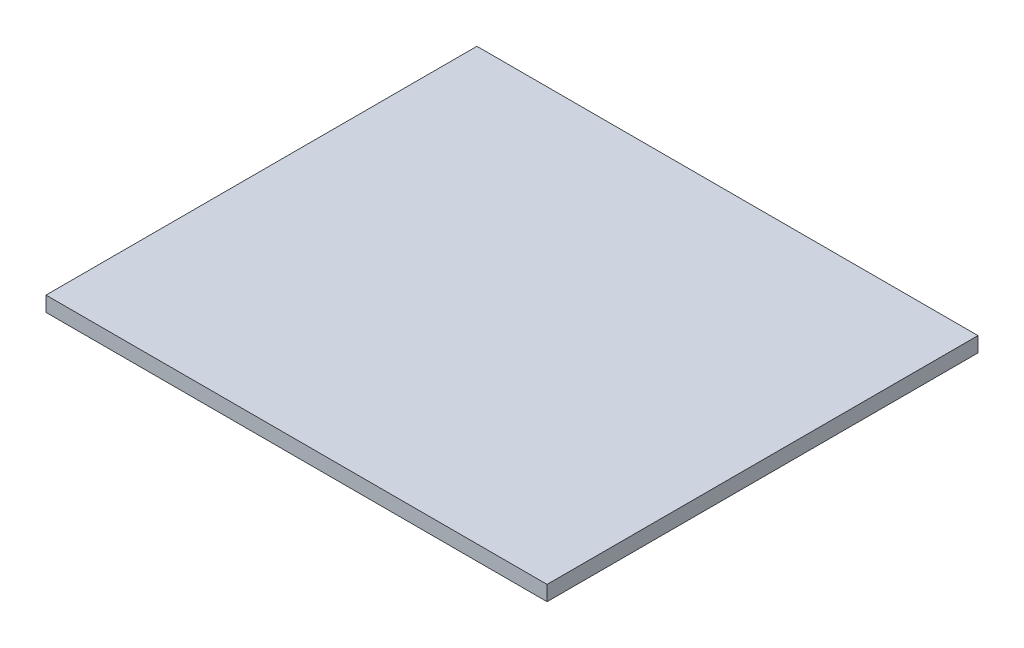
ISO-10303-21;
HEADER;
FILE_DESCRIPTION(('STEP AP214'),'2;1');
FILE_NAME('part.step','',(''),(''),'','','');
FILE_SCHEMA(('AUTOMOTIVE_DESIGN { 1 0 10303 214 1 1 1 1 }'));
ENDSEC;
DATA;
#1=APPLICATION_CONTEXT('core data for automotive mechanical design processes');
#2=APPLICATION_PROTOCOL_DEFINITION('international standard','automotive_design',2000,#1);
#3=PRODUCT_CONTEXT('',#1,'mechanical');
#4=PRODUCT('Part','Part','',(#3));
#5=PRODUCT_RELATED_PRODUCT_CATEGORY('part','',(#4));
#6=PRODUCT_DEFINITION_FORMATION('','',#4);
#7=PRODUCT_DEFINITION_CONTEXT('part definition',#1,'design');
#8=PRODUCT_DEFINITION('design','',#6,#7);
#9=PRODUCT_DEFINITION_SHAPE('','',#8);
#10=(LENGTH_UNIT() NAMED_UNIT(*) SI_UNIT(.MILLI.,.METRE.));
#11=(NAMED_UNIT(*) PLANE_ANGLE_UNIT() SI_UNIT($,.RADIAN.));
#12=(NAMED_UNIT(*) SI_UNIT($,.STERADIAN.) SOLID_ANGLE_UNIT());
#13=UNCERTAINTY_MEASURE_WITH_UNIT(LENGTH_MEASURE(1.E-05),#10,'distance_accuracy_value','');
#14=(GEOMETRIC_REPRESENTATION_CONTEXT(3) GLOBAL_UNCERTAINTY_ASSIGNED_CONTEXT((#13)) GLOBAL_UNIT_ASSIGNED_CONTEXT((#10,
#11,#12)) REPRESENTATION_CONTEXT('',''));
#15=CARTESIAN_POINT('',(0.,0.,0.));
#16=DIRECTION('',(0.,0.,1.));
#17=DIRECTION('',(1.,0.,0.));
#18=AXIS2_PLACEMENT_3D('',#15,#16,#17);
#19=CARTESIAN_POINT('',(50.,3.,43.));
#20=DIRECTION('',(-1.,0.,0.));
#21=DIRECTION('',(0.,0.,1.));
#22=AXIS2_PLACEMENT_3D('',#19,#20,#21);
#23=PLANE('',#22);
#24=DIRECTION('',(0.,0.,-1.));
#25=VECTOR('',#24,1.);
#26=CARTESIAN_POINT('',(50.,0.,43.));
#27=LINE('',#26,#25);
#28=CARTESIAN_POINT('',(50.,0.,43.));
#29=VERTEX_POINT('',#28);
#30=CARTESIAN_POINT('',(50.,0.,-43.));
#31=VERTEX_POINT('',#30);
#32=EDGE_CURVE('E113',#29,#31,#27,.T.);
#33=ORIENTED_EDGE('',*,*,#32,.T.);
#34=DIRECTION('',(0.,-1.,0.));
#35=VECTOR('',#34,1.);
#36=CARTESIAN_POINT('',(50.,3.,-43.));
#37=LINE('',#36,#35);
#38=CARTESIAN_POINT('',(50.,3.,-43.));
#39=VERTEX_POINT('',#38);
#40=EDGE_CURVE('E11',#39,#31,#37,.T.);
#41=ORIENTED_EDGE('',*,*,#40,.F.);
#42=DIRECTION('',(0.,0.,-1.));
#43=VECTOR('',#42,1.);
#44=CARTESIAN_POINT('',(50.,3.,43.));
#45=LINE('',#44,#43);
#46=CARTESIAN_POINT('',(50.,3.,43.));
#47=VERTEX_POINT('',#46);
#48=EDGE_CURVE('E97',#47,#39,#45,.T.);
#49=ORIENTED_EDGE('',*,*,#48,.F.);
#50=DIRECTION('',(0.,-1.,0.));
#51=VECTOR('',#50,1.);
#52=CARTESIAN_POINT('',(50.,3.,43.));
#53=LINE('',#52,#51);
#54=EDGE_CURVE('E109',#47,#29,#53,.T.);
#55=ORIENTED_EDGE('',*,*,#54,.T.);
#56=EDGE_LOOP('',(#33,#41,#49,#55));
#57=FACE_BOUND('',#56,.T.);
#58=ADVANCED_FACE('F45',(#57),#23,.F.);
#59=CARTESIAN_POINT('',(-50.,3.,-43.));
#60=DIRECTION('',(0.,0.,1.));
#61=DIRECTION('',(1.,0.,0.));
#62=AXIS2_PLACEMENT_3D('',#59,#60,#61);
#63=PLANE('',#62);
#64=DIRECTION('',(-1.,0.,0.));
#65=VECTOR('',#64,1.);
#66=CARTESIAN_POINT('',(-50.,0.,-43.));
#67=LINE('',#66,#65);
#68=CARTESIAN_POINT('',(-50.,0.,-43.));
#69=VERTEX_POINT('',#68);
#70=EDGE_CURVE('E102',#31,#69,#67,.T.);
#71=ORIENTED_EDGE('',*,*,#70,.T.);
#72=DIRECTION('',(0.,-1.,0.));
#73=VECTOR('',#72,1.);
#74=CARTESIAN_POINT('',(-50.,3.,-43.));
#75=LINE('',#74,#73);
#76=CARTESIAN_POINT('',(-50.,3.,-43.));
#77=VERTEX_POINT('',#76);
#78=EDGE_CURVE('E54',#77,#69,#75,.T.);
#79=ORIENTED_EDGE('',*,*,#78,.F.);
#80=DIRECTION('',(-1.,0.,0.));
#81=VECTOR('',#80,1.);
#82=CARTESIAN_POINT('',(-50.,3.,-43.));
#83=LINE('',#82,#81);
#84=EDGE_CURVE('E92',#39,#77,#83,.T.);
#85=ORIENTED_EDGE('',*,*,#84,.F.);
#86=ORIENTED_EDGE('',*,*,#40,.T.);
#87=EDGE_LOOP('',(#71,#79,#85,#86));
#88=FACE_BOUND('',#87,.T.);
#89=ADVANCED_FACE('F101',(#88),#63,.F.);
#90=CARTESIAN_POINT('',(-50.,3.,43.));
#91=DIRECTION('',(1.,0.,0.));
#92=DIRECTION('',(0.,0.,-1.));
#93=AXIS2_PLACEMENT_3D('',#90,#91,#92);
#94=PLANE('',#93);
#95=DIRECTION('',(0.,0.,1.));
#96=VECTOR('',#95,1.);
#97=CARTESIAN_POINT('',(-50.,0.,43.));
#98=LINE('',#97,#96);
#99=CARTESIAN_POINT('',(-50.,0.,43.));
#100=VERTEX_POINT('',#99);
#101=EDGE_CURVE('E79',#69,#100,#98,.T.);
#102=ORIENTED_EDGE('',*,*,#101,.T.);
#103=DIRECTION('',(0.,-1.,0.));
#104=VECTOR('',#103,1.);
#105=CARTESIAN_POINT('',(-50.,3.,43.));
#106=LINE('',#105,#104);
#107=CARTESIAN_POINT('',(-50.,3.,43.));
#108=VERTEX_POINT('',#107);
#109=EDGE_CURVE('E104',#108,#100,#106,.T.);
#110=ORIENTED_EDGE('',*,*,#109,.F.);
#111=DIRECTION('',(0.,0.,1.));
#112=VECTOR('',#111,1.);
#113=CARTESIAN_POINT('',(-50.,3.,43.));
#114=LINE('',#113,#112);
#115=EDGE_CURVE('E95',#77,#108,#114,.T.);
#116=ORIENTED_EDGE('',*,*,#115,.F.);
#117=ORIENTED_EDGE('',*,*,#78,.T.);
#118=EDGE_LOOP('',(#102,#110,#116,#117));
#119=FACE_BOUND('',#118,.T.);
#120=ADVANCED_FACE('F105',(#119),#94,.F.);
#121=CARTESIAN_POINT('',(-50.,3.,43.));
#122=DIRECTION('',(0.,0.,-1.));
#123=DIRECTION('',(-1.,0.,0.));
#124=AXIS2_PLACEMENT_3D('',#121,#122,#123);
#125=PLANE('',#124);
#126=DIRECTION('',(1.,0.,0.));
#127=VECTOR('',#126,1.);
#128=CARTESIAN_POINT('',(-50.,0.,43.));
#129=LINE('',#128,#127);
#130=EDGE_CURVE('E85',#100,#29,#129,.T.);
#131=ORIENTED_EDGE('',*,*,#130,.T.);
#132=ORIENTED_EDGE('',*,*,#54,.F.);
#133=DIRECTION('',(1.,0.,0.));
#134=VECTOR('',#133,1.);
#135=CARTESIAN_POINT('',(-50.,3.,43.));
#136=LINE('',#135,#134);
#137=EDGE_CURVE('E62',#108,#47,#136,.T.);
#138=ORIENTED_EDGE('',*,*,#137,.F.);
#139=ORIENTED_EDGE('',*,*,#109,.T.);
#140=EDGE_LOOP('',(#131,#132,#138,#139));
#141=FACE_BOUND('',#140,.T.);
#142=ADVANCED_FACE('F126',(#141),#125,.F.);
#143=CARTESIAN_POINT('',(0.,3.,0.));
#144=DIRECTION('',(0.,-1.,0.));
#145=DIRECTION('',(0.,0.,-1.));
#146=AXIS2_PLACEMENT_3D('',#143,#144,#145);
#147=PLANE('',#146);
#148=ORIENTED_EDGE('',*,*,#48,.T.);
#149=ORIENTED_EDGE('',*,*,#84,.T.);
#150=ORIENTED_EDGE('',*,*,#115,.T.);
#151=ORIENTED_EDGE('',*,*,#137,.T.);
#152=EDGE_LOOP('',(#148,#149,#150,#151));
#153=FACE_BOUND('',#152,.T.);
#154=ADVANCED_FACE('F93',(#153),#147,.F.);
#155=CARTESIAN_POINT('',(0.,0.,0.));
#156=DIRECTION('',(0.,-1.,0.));
#157=DIRECTION('',(0.,0.,-1.));
#158=AXIS2_PLACEMENT_3D('',#155,#156,#157);
#159=PLANE('',#158);
#160=ORIENTED_EDGE('',*,*,#32,.F.);
#161=ORIENTED_EDGE('',*,*,#130,.F.);
#162=ORIENTED_EDGE('',*,*,#101,.F.);
#163=ORIENTED_EDGE('',*,*,#70,.F.);
#164=EDGE_LOOP('',(#160,#161,#162,#163));
#165=FACE_BOUND('',#164,.T.);
#166=ADVANCED_FACE('F129',(#165),#159,.T.);
#167=CLOSED_SHELL('',(#58,#89,#120,#142,#154,#166));
#168=MANIFOLD_SOLID_BREP('B2',#167);
#169=ADVANCED_BREP_SHAPE_REPRESENTATION('',(#18,#168),#14);
#170=SHAPE_DEFINITION_REPRESENTATION(#9,#169);
ENDSEC;
END-ISO-10303-21;
